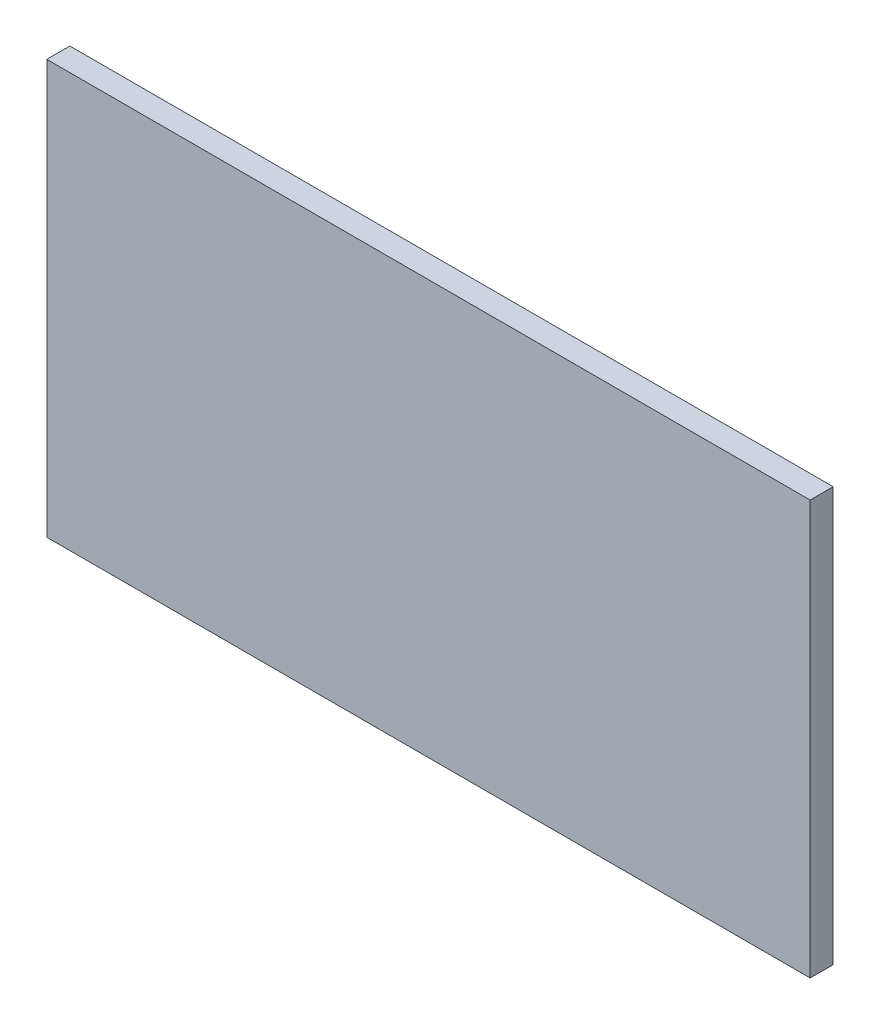
ISO-10303-21;
HEADER;
FILE_DESCRIPTION(('STEP AP214'),'2;1');
FILE_NAME('part.step','',(''),(''),'','','');
FILE_SCHEMA(('AUTOMOTIVE_DESIGN { 1 0 10303 214 1 1 1 1 }'));
ENDSEC;
DATA;
#1=APPLICATION_CONTEXT('core data for automotive mechanical design processes');
#2=APPLICATION_PROTOCOL_DEFINITION('international standard','automotive_design',2000,#1);
#3=PRODUCT_CONTEXT('',#1,'mechanical');
#4=PRODUCT('Part','Part','',(#3));
#5=PRODUCT_RELATED_PRODUCT_CATEGORY('part','',(#4));
#6=PRODUCT_DEFINITION_FORMATION('','',#4);
#7=PRODUCT_DEFINITION_CONTEXT('part definition',#1,'design');
#8=PRODUCT_DEFINITION('design','',#6,#7);
#9=PRODUCT_DEFINITION_SHAPE('','',#8);
#10=(LENGTH_UNIT() NAMED_UNIT(*) SI_UNIT(.MILLI.,.METRE.));
#11=(NAMED_UNIT(*) PLANE_ANGLE_UNIT() SI_UNIT($,.RADIAN.));
#12=(NAMED_UNIT(*) SI_UNIT($,.STERADIAN.) SOLID_ANGLE_UNIT());
#13=UNCERTAINTY_MEASURE_WITH_UNIT(LENGTH_MEASURE(1.E-05),#10,'distance_accuracy_value','');
#14=(GEOMETRIC_REPRESENTATION_CONTEXT(3) GLOBAL_UNCERTAINTY_ASSIGNED_CONTEXT((#13)) GLOBAL_UNIT_ASSIGNED_CONTEXT((#10,
#11,#12)) REPRESENTATION_CONTEXT('',''));
#15=CARTESIAN_POINT('',(0.,0.,0.));
#16=DIRECTION('',(0.,0.,1.));
#17=DIRECTION('',(1.,0.,0.));
#18=AXIS2_PLACEMENT_3D('',#15,#16,#17);
#19=CARTESIAN_POINT('',(-16.0635,-9.4,1.));
#20=DIRECTION('',(1.,0.,0.));
#21=DIRECTION('',(0.,0.,-1.));
#22=AXIS2_PLACEMENT_3D('',#19,#20,#21);
#23=PLANE('',#22);
#24=DIRECTION('',(0.,-1.,0.));
#25=VECTOR('',#24,1.);
#26=CARTESIAN_POINT('',(-16.0635,-9.4,0.));
#27=LINE('',#26,#25);
#28=CARTESIAN_POINT('',(-16.0635,8.5635,0.));
#29=VERTEX_POINT('',#28);
#30=CARTESIAN_POINT('',(-16.0635,-9.4,0.));
#31=VERTEX_POINT('',#30);
#32=EDGE_CURVE('E96',#29,#31,#27,.T.);
#33=ORIENTED_EDGE('',*,*,#32,.T.);
#34=DIRECTION('',(0.,0.,-1.));
#35=VECTOR('',#34,1.);
#36=CARTESIAN_POINT('',(-16.0635,-9.4,1.));
#37=LINE('',#36,#35);
#38=CARTESIAN_POINT('',(-16.0635,-9.4,1.));
#39=VERTEX_POINT('',#38);
#40=EDGE_CURVE('E11',#39,#31,#37,.T.);
#41=ORIENTED_EDGE('',*,*,#40,.F.);
#42=DIRECTION('',(0.,-1.,0.));
#43=VECTOR('',#42,1.);
#44=CARTESIAN_POINT('',(-16.0635,-9.4,1.));
#45=LINE('',#44,#43);
#46=CARTESIAN_POINT('',(-16.0635,8.5635,1.));
#47=VERTEX_POINT('',#46);
#48=EDGE_CURVE('E84',#47,#39,#45,.T.);
#49=ORIENTED_EDGE('',*,*,#48,.F.);
#50=DIRECTION('',(0.,0.,-1.));
#51=VECTOR('',#50,1.);
#52=CARTESIAN_POINT('',(-16.0635,8.5635,1.));
#53=LINE('',#52,#51);
#54=EDGE_CURVE('E92',#47,#29,#53,.T.);
#55=ORIENTED_EDGE('',*,*,#54,.T.);
#56=EDGE_LOOP('',(#33,#41,#49,#55));
#57=FACE_BOUND('',#56,.T.);
#58=ADVANCED_FACE('F33',(#57),#23,.F.);
#59=CARTESIAN_POINT('',(17.0635,-9.4,1.));
#60=DIRECTION('',(0.,1.,0.));
#61=DIRECTION('',(0.,0.,1.));
#62=AXIS2_PLACEMENT_3D('',#59,#60,#61);
#63=PLANE('',#62);
#64=DIRECTION('',(1.,0.,0.));
#65=VECTOR('',#64,1.);
#66=CARTESIAN_POINT('',(17.0635,-9.4,0.));
#67=LINE('',#66,#65);
#68=CARTESIAN_POINT('',(17.0635,-9.4,0.));
#69=VERTEX_POINT('',#68);
#70=EDGE_CURVE('E88',#31,#69,#67,.T.);
#71=ORIENTED_EDGE('',*,*,#70,.T.);
#72=DIRECTION('',(0.,0.,-1.));
#73=VECTOR('',#72,1.);
#74=CARTESIAN_POINT('',(17.0635,-9.4,1.));
#75=LINE('',#74,#73);
#76=CARTESIAN_POINT('',(17.0635,-9.4,1.));
#77=VERTEX_POINT('',#76);
#78=EDGE_CURVE('E41',#77,#69,#75,.T.);
#79=ORIENTED_EDGE('',*,*,#78,.F.);
#80=DIRECTION('',(1.,0.,0.));
#81=VECTOR('',#80,1.);
#82=CARTESIAN_POINT('',(17.0635,-9.4,1.));
#83=LINE('',#82,#81);
#84=EDGE_CURVE('E79',#39,#77,#83,.T.);
#85=ORIENTED_EDGE('',*,*,#84,.F.);
#86=ORIENTED_EDGE('',*,*,#40,.T.);
#87=EDGE_LOOP('',(#71,#79,#85,#86));
#88=FACE_BOUND('',#87,.T.);
#89=ADVANCED_FACE('F87',(#88),#63,.F.);
#90=CARTESIAN_POINT('',(17.0635,8.5635,1.));
#91=DIRECTION('',(-1.,0.,0.));
#92=DIRECTION('',(0.,0.,1.));
#93=AXIS2_PLACEMENT_3D('',#90,#91,#92);
#94=PLANE('',#93);
#95=DIRECTION('',(0.,1.,0.));
#96=VECTOR('',#95,1.);
#97=CARTESIAN_POINT('',(17.0635,8.5635,0.));
#98=LINE('',#97,#96);
#99=CARTESIAN_POINT('',(17.0635,8.5635,0.));
#100=VERTEX_POINT('',#99);
#101=EDGE_CURVE('E66',#69,#100,#98,.T.);
#102=ORIENTED_EDGE('',*,*,#101,.T.);
#103=DIRECTION('',(0.,0.,-1.));
#104=VECTOR('',#103,1.);
#105=CARTESIAN_POINT('',(17.0635,8.5635,1.));
#106=LINE('',#105,#104);
#107=CARTESIAN_POINT('',(17.0635,8.5635,1.));
#108=VERTEX_POINT('',#107);
#109=EDGE_CURVE('E89',#108,#100,#106,.T.);
#110=ORIENTED_EDGE('',*,*,#109,.F.);
#111=DIRECTION('',(0.,1.,0.));
#112=VECTOR('',#111,1.);
#113=CARTESIAN_POINT('',(17.0635,8.5635,1.));
#114=LINE('',#113,#112);
#115=EDGE_CURVE('E82',#77,#108,#114,.T.);
#116=ORIENTED_EDGE('',*,*,#115,.F.);
#117=ORIENTED_EDGE('',*,*,#78,.T.);
#118=EDGE_LOOP('',(#102,#110,#116,#117));
#119=FACE_BOUND('',#118,.T.);
#120=ADVANCED_FACE('F90',(#119),#94,.F.);
#121=CARTESIAN_POINT('',(-16.0635,8.5635,1.));
#122=DIRECTION('',(0.,-1.,0.));
#123=DIRECTION('',(0.,0.,-1.));
#124=AXIS2_PLACEMENT_3D('',#121,#122,#123);
#125=PLANE('',#124);
#126=DIRECTION('',(-1.,0.,0.));
#127=VECTOR('',#126,1.);
#128=CARTESIAN_POINT('',(-16.0635,8.5635,0.));
#129=LINE('',#128,#127);
#130=EDGE_CURVE('E72',#100,#29,#129,.T.);
#131=ORIENTED_EDGE('',*,*,#130,.T.);
#132=ORIENTED_EDGE('',*,*,#54,.F.);
#133=DIRECTION('',(-1.,0.,0.));
#134=VECTOR('',#133,1.);
#135=CARTESIAN_POINT('',(-16.0635,8.5635,1.));
#136=LINE('',#135,#134);
#137=EDGE_CURVE('E49',#108,#47,#136,.T.);
#138=ORIENTED_EDGE('',*,*,#137,.F.);
#139=ORIENTED_EDGE('',*,*,#109,.T.);
#140=EDGE_LOOP('',(#131,#132,#138,#139));
#141=FACE_BOUND('',#140,.T.);
#142=ADVANCED_FACE('F103',(#141),#125,.F.);
#143=CARTESIAN_POINT('',(0.,0.,1.));
#144=DIRECTION('',(0.,0.,-1.));
#145=DIRECTION('',(-1.,0.,0.));
#146=AXIS2_PLACEMENT_3D('',#143,#144,#145);
#147=PLANE('',#146);
#148=ORIENTED_EDGE('',*,*,#48,.T.);
#149=ORIENTED_EDGE('',*,*,#84,.T.);
#150=ORIENTED_EDGE('',*,*,#115,.T.);
#151=ORIENTED_EDGE('',*,*,#137,.T.);
#152=EDGE_LOOP('',(#148,#149,#150,#151));
#153=FACE_BOUND('',#152,.T.);
#154=ADVANCED_FACE('F80',(#153),#147,.F.);
#155=CARTESIAN_POINT('',(0.,0.,0.));
#156=DIRECTION('',(0.,0.,-1.));
#157=DIRECTION('',(-1.,0.,0.));
#158=AXIS2_PLACEMENT_3D('',#155,#156,#157);
#159=PLANE('',#158);
#160=ORIENTED_EDGE('',*,*,#32,.F.);
#161=ORIENTED_EDGE('',*,*,#130,.F.);
#162=ORIENTED_EDGE('',*,*,#101,.F.);
#163=ORIENTED_EDGE('',*,*,#70,.F.);
#164=EDGE_LOOP('',(#160,#161,#162,#163));
#165=FACE_BOUND('',#164,.T.);
#166=ADVANCED_FACE('F106',(#165),#159,.T.);
#167=CLOSED_SHELL('',(#58,#89,#120,#142,#154,#166));
#168=MANIFOLD_SOLID_BREP('B2',#167);
#169=ADVANCED_BREP_SHAPE_REPRESENTATION('',(#18,#168),#14);
#170=SHAPE_DEFINITION_REPRESENTATION(#9,#169);
ENDSEC;
END-ISO-10303-21;
